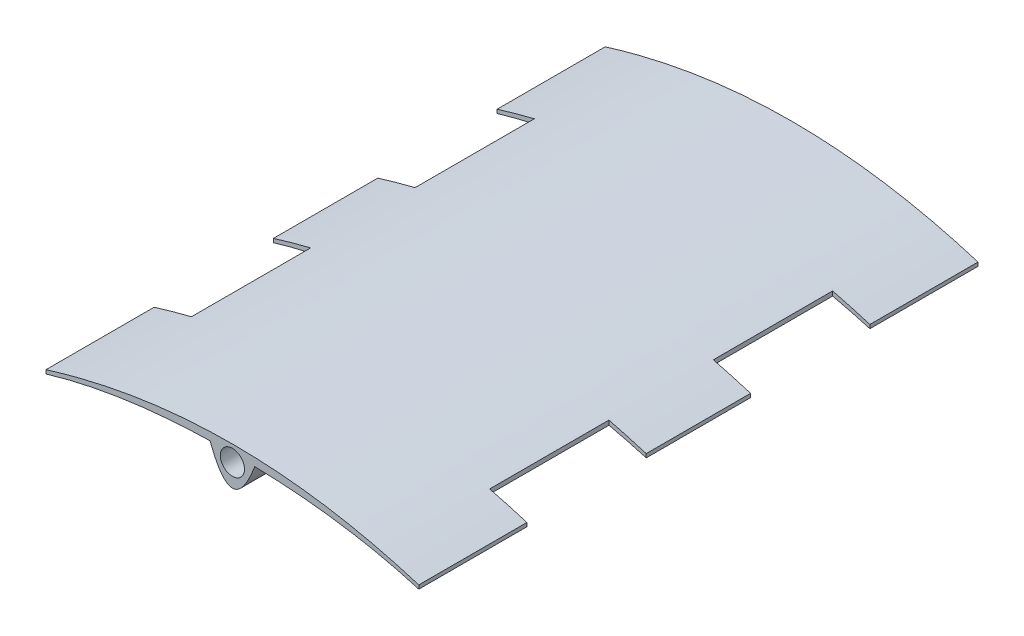
ISO-10303-21;
HEADER;
FILE_DESCRIPTION(('STEP AP214'),'2;1');
FILE_NAME('part.step','',(''),(''),'','','');
FILE_SCHEMA(('AUTOMOTIVE_DESIGN { 1 0 10303 214 1 1 1 1 }'));
ENDSEC;
DATA;
#1=APPLICATION_CONTEXT('core data for automotive mechanical design processes');
#2=APPLICATION_PROTOCOL_DEFINITION('international standard','automotive_design',2000,#1);
#3=PRODUCT_CONTEXT('',#1,'mechanical');
#4=PRODUCT('Part','Part','',(#3));
#5=PRODUCT_RELATED_PRODUCT_CATEGORY('part','',(#4));
#6=PRODUCT_DEFINITION_FORMATION('','',#4);
#7=PRODUCT_DEFINITION_CONTEXT('part definition',#1,'design');
#8=PRODUCT_DEFINITION('design','',#6,#7);
#9=PRODUCT_DEFINITION_SHAPE('','',#8);
#10=(LENGTH_UNIT() NAMED_UNIT(*) SI_UNIT(.MILLI.,.METRE.));
#11=(NAMED_UNIT(*) PLANE_ANGLE_UNIT() SI_UNIT($,.RADIAN.));
#12=(NAMED_UNIT(*) SI_UNIT($,.STERADIAN.) SOLID_ANGLE_UNIT());
#13=UNCERTAINTY_MEASURE_WITH_UNIT(LENGTH_MEASURE(1.E-05),#10,'distance_accuracy_value','');
#14=(GEOMETRIC_REPRESENTATION_CONTEXT(3) GLOBAL_UNCERTAINTY_ASSIGNED_CONTEXT((#13)) GLOBAL_UNIT_ASSIGNED_CONTEXT((#10,
#11,#12)) REPRESENTATION_CONTEXT('',''));
#15=CARTESIAN_POINT('',(0.,0.,0.));
#16=DIRECTION('',(0.,0.,1.));
#17=DIRECTION('',(1.,0.,0.));
#18=AXIS2_PLACEMENT_3D('',#15,#16,#17);
#19=CARTESIAN_POINT('',(-50.,-3.48064682392032,150.));
#20=DIRECTION('',(1.,0.,0.));
#21=DIRECTION('',(0.,0.,-1.));
#22=AXIS2_PLACEMENT_3D('',#19,#20,#21);
#23=PLANE('',#22);
#24=DIRECTION('',(0.,0.,-1.));
#25=VECTOR('',#24,1.);
#26=CARTESIAN_POINT('',(-50.,-4.48064682392032,150.));
#27=LINE('',#26,#25);
#28=CARTESIAN_POINT('',(-50.,-4.48064682392032,29.));
#29=VERTEX_POINT('',#28);
#30=CARTESIAN_POINT('',(-50.,-4.48064682392032,0.));
#31=VERTEX_POINT('',#30);
#32=EDGE_CURVE('E526',#29,#31,#27,.T.);
#33=ORIENTED_EDGE('',*,*,#32,.F.);
#34=DIRECTION('',(0.,1.,0.));
#35=VECTOR('',#34,1.);
#36=CARTESIAN_POINT('',(-50.,-6.,29.));
#37=LINE('',#36,#35);
#38=CARTESIAN_POINT('',(-50.,-3.48064682392032,29.));
#39=VERTEX_POINT('',#38);
#40=EDGE_CURVE('E441',#29,#39,#37,.T.);
#41=ORIENTED_EDGE('',*,*,#40,.T.);
#42=DIRECTION('',(0.,0.,-1.));
#43=VECTOR('',#42,1.);
#44=CARTESIAN_POINT('',(-50.,-3.48064682392032,150.));
#45=LINE('',#44,#43);
#46=CARTESIAN_POINT('',(-50.,-3.48064682392032,0.));
#47=VERTEX_POINT('',#46);
#48=EDGE_CURVE('E390',#39,#47,#45,.T.);
#49=ORIENTED_EDGE('',*,*,#48,.T.);
#50=DIRECTION('',(0.,-1.,0.));
#51=VECTOR('',#50,1.);
#52=CARTESIAN_POINT('',(-50.,-3.48064682392032,0.));
#53=LINE('',#52,#51);
#54=EDGE_CURVE('E491',#47,#31,#53,.T.);
#55=ORIENTED_EDGE('',*,*,#54,.T.);
#56=EDGE_LOOP('',(#33,#41,#49,#55));
#57=FACE_BOUND('',#56,.T.);
#58=ADVANCED_FACE('F33',(#57),#23,.F.);
#59=CARTESIAN_POINT('',(-50.,-3.48064682392032,89.));
#60=VERTEX_POINT('',#59);
#61=CARTESIAN_POINT('',(-50.,-3.48064682392032,61.));
#62=VERTEX_POINT('',#61);
#63=EDGE_CURVE('E385',#60,#62,#45,.T.);
#64=ORIENTED_EDGE('',*,*,#63,.T.);
#65=DIRECTION('',(0.,1.,0.));
#66=VECTOR('',#65,1.);
#67=CARTESIAN_POINT('',(-50.,-6.,61.));
#68=LINE('',#67,#66);
#69=CARTESIAN_POINT('',(-50.,-4.48064682392032,61.));
#70=VERTEX_POINT('',#69);
#71=EDGE_CURVE('E387',#70,#62,#68,.T.);
#72=ORIENTED_EDGE('',*,*,#71,.F.);
#73=CARTESIAN_POINT('',(-50.,-4.48064682392032,89.));
#74=VERTEX_POINT('',#73);
#75=EDGE_CURVE('E741',#74,#70,#27,.T.);
#76=ORIENTED_EDGE('',*,*,#75,.F.);
#77=DIRECTION('',(0.,1.,0.));
#78=VECTOR('',#77,1.);
#79=CARTESIAN_POINT('',(-50.,-6.,89.));
#80=LINE('',#79,#78);
#81=EDGE_CURVE('E212',#74,#60,#80,.T.);
#82=ORIENTED_EDGE('',*,*,#81,.T.);
#83=EDGE_LOOP('',(#64,#72,#76,#82));
#84=FACE_BOUND('',#83,.T.);
#85=ADVANCED_FACE('F363',(#84),#23,.F.);
#86=CARTESIAN_POINT('',(50.,-3.48064682392032,150.));
#87=DIRECTION('',(-1.,0.,0.));
#88=DIRECTION('',(0.,0.,1.));
#89=AXIS2_PLACEMENT_3D('',#86,#87,#88);
#90=PLANE('',#89);
#91=DIRECTION('',(0.,0.,-1.));
#92=VECTOR('',#91,1.);
#93=CARTESIAN_POINT('',(50.,-4.48064682392032,150.));
#94=LINE('',#93,#92);
#95=CARTESIAN_POINT('',(50.,-4.48064682392032,150.));
#96=VERTEX_POINT('',#95);
#97=CARTESIAN_POINT('',(50.,-4.48064682392032,121.));
#98=VERTEX_POINT('',#97);
#99=EDGE_CURVE('E476',#96,#98,#94,.T.);
#100=ORIENTED_EDGE('',*,*,#99,.T.);
#101=DIRECTION('',(0.,1.,0.));
#102=VECTOR('',#101,1.);
#103=CARTESIAN_POINT('',(50.,-3.48064682392032,121.));
#104=LINE('',#103,#102);
#105=CARTESIAN_POINT('',(50.,-3.48064682392032,121.));
#106=VERTEX_POINT('',#105);
#107=EDGE_CURVE('E197',#98,#106,#104,.T.);
#108=ORIENTED_EDGE('',*,*,#107,.T.);
#109=DIRECTION('',(0.,0.,-1.));
#110=VECTOR('',#109,1.);
#111=CARTESIAN_POINT('',(50.,-3.48064682392032,150.));
#112=LINE('',#111,#110);
#113=CARTESIAN_POINT('',(50.,-3.48064682392032,150.));
#114=VERTEX_POINT('',#113);
#115=EDGE_CURVE('E470',#114,#106,#112,.T.);
#116=ORIENTED_EDGE('',*,*,#115,.F.);
#117=DIRECTION('',(0.,1.,0.));
#118=VECTOR('',#117,1.);
#119=CARTESIAN_POINT('',(50.,-3.48064682392032,150.));
#120=LINE('',#119,#118);
#121=EDGE_CURVE('E468',#96,#114,#120,.T.);
#122=ORIENTED_EDGE('',*,*,#121,.F.);
#123=EDGE_LOOP('',(#100,#108,#116,#122));
#124=FACE_BOUND('',#123,.T.);
#125=ADVANCED_FACE('F373',(#124),#90,.F.);
#126=CARTESIAN_POINT('',(50.,-3.48064682392032,89.));
#127=VERTEX_POINT('',#126);
#128=CARTESIAN_POINT('',(50.,-3.48064682392032,61.));
#129=VERTEX_POINT('',#128);
#130=EDGE_CURVE('E471',#127,#129,#112,.T.);
#131=ORIENTED_EDGE('',*,*,#130,.F.);
#132=DIRECTION('',(0.,-1.,0.));
#133=VECTOR('',#132,1.);
#134=CARTESIAN_POINT('',(50.,-3.48064682392032,89.));
#135=LINE('',#134,#133);
#136=CARTESIAN_POINT('',(50.,-4.48064682392032,89.));
#137=VERTEX_POINT('',#136);
#138=EDGE_CURVE('E401',#127,#137,#135,.T.);
#139=ORIENTED_EDGE('',*,*,#138,.T.);
#140=CARTESIAN_POINT('',(50.,-4.48064682392032,61.));
#141=VERTEX_POINT('',#140);
#142=EDGE_CURVE('E474',#137,#141,#94,.T.);
#143=ORIENTED_EDGE('',*,*,#142,.T.);
#144=DIRECTION('',(0.,1.,0.));
#145=VECTOR('',#144,1.);
#146=CARTESIAN_POINT('',(50.,-3.48064682392032,61.));
#147=LINE('',#146,#145);
#148=EDGE_CURVE('E398',#141,#129,#147,.T.);
#149=ORIENTED_EDGE('',*,*,#148,.T.);
#150=EDGE_LOOP('',(#131,#139,#143,#149));
#151=FACE_BOUND('',#150,.T.);
#152=ADVANCED_FACE('F378',(#151),#90,.F.);
#153=CARTESIAN_POINT('',(0.,4.25967658803984,150.));
#154=DIRECTION('',(0.,0.,1.));
#155=DIRECTION('',(1.,0.,0.));
#156=AXIS2_PLACEMENT_3D('',#153,#154,#155);
#157=PLANE('',#156);
#158=CARTESIAN_POINT('',(50.,-3.48064682392032,150.));
#159=CARTESIAN_POINT('',(0.,12.,150.));
#160=CARTESIAN_POINT('',(-50.,-3.48064682392032,150.));
#161=B_SPLINE_CURVE_WITH_KNOTS('',2,(#158,#159,#160),.UNSPECIFIED.,.F.,.F.,(3,3),(0.,1.),.UNSPECIFIED.);
#162=CARTESIAN_POINT('',(-50.,-3.48064682392032,150.));
#163=VERTEX_POINT('',#162);
#164=EDGE_CURVE('E328',#114,#163,#161,.T.);
#165=ORIENTED_EDGE('',*,*,#164,.T.);
#166=DIRECTION('',(0.,-1.,0.));
#167=VECTOR('',#166,1.);
#168=CARTESIAN_POINT('',(-50.,-3.48064682392032,150.));
#169=LINE('',#168,#167);
#170=CARTESIAN_POINT('',(-50.,-4.48064682392032,150.));
#171=VERTEX_POINT('',#170);
#172=EDGE_CURVE('E334',#163,#171,#169,.T.);
#173=ORIENTED_EDGE('',*,*,#172,.T.);
#174=CARTESIAN_POINT('',(-50.,-4.48064682392032,150.));
#175=CARTESIAN_POINT('',(-30.,1.47316015973418,150.));
#176=CARTESIAN_POINT('',(-6.,2.,150.));
#177=B_SPLINE_CURVE_WITH_KNOTS('',2,(#174,#175,#176),.UNSPECIFIED.,.F.,.F.,(3,3),(0.,1.),.UNSPECIFIED.);
#178=CARTESIAN_POINT('',(-6.,2.,150.));
#179=VERTEX_POINT('',#178);
#180=EDGE_CURVE('E340',#171,#179,#177,.T.);
#181=ORIENTED_EDGE('',*,*,#180,.T.);
#182=CARTESIAN_POINT('',(-6.,2.,150.));
#183=CARTESIAN_POINT('',(0.,-14.,150.));
#184=CARTESIAN_POINT('',(6.,2.,150.));
#185=B_SPLINE_CURVE_WITH_KNOTS('',2,(#182,#183,#184),.UNSPECIFIED.,.F.,.F.,(3,3),(0.,1.),.UNSPECIFIED.);
#186=CARTESIAN_POINT('',(6.,2.,150.));
#187=VERTEX_POINT('',#186);
#188=EDGE_CURVE('E345',#179,#187,#185,.T.);
#189=ORIENTED_EDGE('',*,*,#188,.T.);
#190=CARTESIAN_POINT('',(6.,2.,150.));
#191=CARTESIAN_POINT('',(30.,1.47316015973418,150.));
#192=CARTESIAN_POINT('',(50.,-4.48064682392032,150.));
#193=B_SPLINE_CURVE_WITH_KNOTS('',2,(#190,#191,#192),.UNSPECIFIED.,.F.,.F.,(3,3),(0.,1.),.UNSPECIFIED.);
#194=EDGE_CURVE('E482',#187,#96,#193,.T.);
#195=ORIENTED_EDGE('',*,*,#194,.T.);
#196=ORIENTED_EDGE('',*,*,#121,.T.);
#197=EDGE_LOOP('',(#165,#173,#181,#189,#195,#196));
#198=FACE_BOUND('',#197,.T.);
#199=CARTESIAN_POINT('',(0.,0.,150.));
#200=DIRECTION('',(0.,0.,1.));
#201=DIRECTION('',(1.,0.,0.));
#202=AXIS2_PLACEMENT_3D('',#199,#200,#201);
#203=CIRCLE('',#202,3.25);
#204=CARTESIAN_POINT('',(3.25,0.,150.));
#205=VERTEX_POINT('',#204);
#206=EDGE_CURVE('E320',#205,#205,#203,.T.);
#207=ORIENTED_EDGE('',*,*,#206,.F.);
#208=EDGE_LOOP('',(#207));
#209=FACE_BOUND('',#208,.T.);
#210=ADVANCED_FACE('F465',(#198,#209),#157,.T.);
#211=CARTESIAN_POINT('',(0.,4.25967658803984,0.));
#212=DIRECTION('',(0.,0.,1.));
#213=DIRECTION('',(1.,0.,0.));
#214=AXIS2_PLACEMENT_3D('',#211,#212,#213);
#215=PLANE('',#214);
#216=CARTESIAN_POINT('',(50.,-3.48064682392032,0.));
#217=CARTESIAN_POINT('',(0.,12.,0.));
#218=CARTESIAN_POINT('',(-50.,-3.48064682392032,0.));
#219=B_SPLINE_CURVE_WITH_KNOTS('',2,(#216,#217,#218),.UNSPECIFIED.,.F.,.F.,(3,3),(0.,1.),.UNSPECIFIED.);
#220=CARTESIAN_POINT('',(50.,-3.48064682392032,0.));
#221=VERTEX_POINT('',#220);
#222=EDGE_CURVE('E326',#221,#47,#219,.T.);
#223=ORIENTED_EDGE('',*,*,#222,.F.);
#224=DIRECTION('',(0.,1.,0.));
#225=VECTOR('',#224,1.);
#226=CARTESIAN_POINT('',(50.,-3.48064682392032,0.));
#227=LINE('',#226,#225);
#228=CARTESIAN_POINT('',(50.,-4.48064682392032,0.));
#229=VERTEX_POINT('',#228);
#230=EDGE_CURVE('E335',#229,#221,#227,.T.);
#231=ORIENTED_EDGE('',*,*,#230,.F.);
#232=CARTESIAN_POINT('',(6.,2.,0.));
#233=CARTESIAN_POINT('',(30.,1.47316015973418,0.));
#234=CARTESIAN_POINT('',(50.,-4.48064682392032,0.));
#235=B_SPLINE_CURVE_WITH_KNOTS('',2,(#232,#233,#234),.UNSPECIFIED.,.F.,.F.,(3,3),(0.,1.),.UNSPECIFIED.);
#236=CARTESIAN_POINT('',(6.,2.,0.));
#237=VERTEX_POINT('',#236);
#238=EDGE_CURVE('E508',#237,#229,#235,.T.);
#239=ORIENTED_EDGE('',*,*,#238,.F.);
#240=CARTESIAN_POINT('',(-6.,2.,0.));
#241=CARTESIAN_POINT('',(0.,-14.,0.));
#242=CARTESIAN_POINT('',(6.,2.,0.));
#243=B_SPLINE_CURVE_WITH_KNOTS('',2,(#240,#241,#242),.UNSPECIFIED.,.F.,.F.,(3,3),(0.,1.),.UNSPECIFIED.);
#244=CARTESIAN_POINT('',(-6.,2.,0.));
#245=VERTEX_POINT('',#244);
#246=EDGE_CURVE('E501',#245,#237,#243,.T.);
#247=ORIENTED_EDGE('',*,*,#246,.F.);
#248=CARTESIAN_POINT('',(-50.,-4.48064682392032,0.));
#249=CARTESIAN_POINT('',(-30.,1.47316015973418,0.));
#250=CARTESIAN_POINT('',(-6.,2.,0.));
#251=B_SPLINE_CURVE_WITH_KNOTS('',2,(#248,#249,#250),.UNSPECIFIED.,.F.,.F.,(3,3),(0.,1.),.UNSPECIFIED.);
#252=EDGE_CURVE('E497',#31,#245,#251,.T.);
#253=ORIENTED_EDGE('',*,*,#252,.F.);
#254=ORIENTED_EDGE('',*,*,#54,.F.);
#255=EDGE_LOOP('',(#223,#231,#239,#247,#253,#254));
#256=FACE_BOUND('',#255,.T.);
#257=CARTESIAN_POINT('',(0.,0.,0.));
#258=DIRECTION('',(0.,0.,1.));
#259=DIRECTION('',(1.,0.,0.));
#260=AXIS2_PLACEMENT_3D('',#257,#258,#259);
#261=CIRCLE('',#260,3.25);
#262=CARTESIAN_POINT('',(3.25,0.,0.));
#263=VERTEX_POINT('',#262);
#264=EDGE_CURVE('E319',#263,#263,#261,.T.);
#265=ORIENTED_EDGE('',*,*,#264,.T.);
#266=EDGE_LOOP('',(#265));
#267=FACE_BOUND('',#266,.T.);
#268=ADVANCED_FACE('F367',(#256,#267),#215,.F.);
#269=DIRECTION('',(0.,0.,-1.));
#270=VECTOR('',#269,1.);
#271=SURFACE_OF_LINEAR_EXTRUSION('',#161,#270);
#272=ORIENTED_EDGE('',*,*,#115,.T.);
#273=CARTESIAN_POINT('',(50.,-3.48064682392032,121.));
#274=CARTESIAN_POINT('',(0.,12.,121.));
#275=CARTESIAN_POINT('',(-50.,-3.48064682392032,121.));
#276=B_SPLINE_CURVE_WITH_KNOTS('',2,(#273,#274,#275),.UNSPECIFIED.,.F.,.F.,(3,3),(0.,1.),.UNSPECIFIED.);
#277=CARTESIAN_POINT('',(40.,-0.694130395614669,121.));
#278=VERTEX_POINT('',#277);
#279=EDGE_CURVE('E268',#106,#278,#276,.T.);
#280=ORIENTED_EDGE('',*,*,#279,.T.);
#281=DIRECTION('',(0.,0.,-1.));
#282=VECTOR('',#281,1.);
#283=CARTESIAN_POINT('',(40.,-0.694130395614669,150.));
#284=LINE('',#283,#282);
#285=CARTESIAN_POINT('',(40.,-0.694130395614667,89.));
#286=VERTEX_POINT('',#285);
#287=EDGE_CURVE('E281',#278,#286,#284,.T.);
#288=ORIENTED_EDGE('',*,*,#287,.T.);
#289=CARTESIAN_POINT('',(50.,-3.48064682392032,89.));
#290=CARTESIAN_POINT('',(0.,12.,89.));
#291=CARTESIAN_POINT('',(-50.,-3.48064682392032,89.));
#292=B_SPLINE_CURVE_WITH_KNOTS('',2,(#289,#290,#291),.UNSPECIFIED.,.F.,.F.,(3,3),(0.,1.),.UNSPECIFIED.);
#293=EDGE_CURVE('E252',#286,#127,#292,.F.);
#294=ORIENTED_EDGE('',*,*,#293,.T.);
#295=ORIENTED_EDGE('',*,*,#130,.T.);
#296=CARTESIAN_POINT('',(50.,-3.48064682392032,61.));
#297=CARTESIAN_POINT('',(0.,12.,61.));
#298=CARTESIAN_POINT('',(-50.,-3.48064682392032,61.));
#299=B_SPLINE_CURVE_WITH_KNOTS('',2,(#296,#297,#298),.UNSPECIFIED.,.F.,.F.,(3,3),(0.,1.),.UNSPECIFIED.);
#300=CARTESIAN_POINT('',(40.,-0.694130395614685,61.));
#301=VERTEX_POINT('',#300);
#302=EDGE_CURVE('E236',#129,#301,#299,.T.);
#303=ORIENTED_EDGE('',*,*,#302,.T.);
#304=DIRECTION('',(0.,0.,-1.));
#305=VECTOR('',#304,1.);
#306=CARTESIAN_POINT('',(40.0000000000001,-0.694130395614685,150.));
#307=LINE('',#306,#305);
#308=CARTESIAN_POINT('',(40.,-0.694130395614657,29.));
#309=VERTEX_POINT('',#308);
#310=EDGE_CURVE('E276',#301,#309,#307,.T.);
#311=ORIENTED_EDGE('',*,*,#310,.T.);
#312=CARTESIAN_POINT('',(50.,-3.48064682392032,29.));
#313=CARTESIAN_POINT('',(0.,12.,29.));
#314=CARTESIAN_POINT('',(-50.,-3.48064682392032,29.));
#315=B_SPLINE_CURVE_WITH_KNOTS('',2,(#312,#313,#314),.UNSPECIFIED.,.F.,.F.,(3,3),(0.,1.),.UNSPECIFIED.);
#316=CARTESIAN_POINT('',(50.,-3.48064682392032,29.));
#317=VERTEX_POINT('',#316);
#318=EDGE_CURVE('E204',#309,#317,#315,.F.);
#319=ORIENTED_EDGE('',*,*,#318,.T.);
#320=EDGE_CURVE('E473',#317,#221,#112,.T.);
#321=ORIENTED_EDGE('',*,*,#320,.T.);
#322=ORIENTED_EDGE('',*,*,#222,.T.);
#323=ORIENTED_EDGE('',*,*,#48,.F.);
#324=CARTESIAN_POINT('',(50.,-3.48064682392032,29.));
#325=CARTESIAN_POINT('',(0.,12.,29.));
#326=CARTESIAN_POINT('',(-50.,-3.48064682392032,29.));
#327=B_SPLINE_CURVE_WITH_KNOTS('',2,(#324,#325,#326),.UNSPECIFIED.,.F.,.F.,(3,3),(0.,1.),.UNSPECIFIED.);
#328=CARTESIAN_POINT('',(-40.,-0.694130395614653,29.));
#329=VERTEX_POINT('',#328);
#330=EDGE_CURVE('E314',#39,#329,#327,.F.);
#331=ORIENTED_EDGE('',*,*,#330,.T.);
#332=DIRECTION('',(0.,0.,-1.));
#333=VECTOR('',#332,1.);
#334=CARTESIAN_POINT('',(-40.,-0.694130395614653,150.));
#335=LINE('',#334,#333);
#336=CARTESIAN_POINT('',(-40.,-0.694130395614659,61.));
#337=VERTEX_POINT('',#336);
#338=EDGE_CURVE('E308',#329,#337,#335,.F.);
#339=ORIENTED_EDGE('',*,*,#338,.T.);
#340=CARTESIAN_POINT('',(50.,-3.48064682392032,61.));
#341=CARTESIAN_POINT('',(0.,12.,61.));
#342=CARTESIAN_POINT('',(-50.,-3.48064682392032,61.));
#343=B_SPLINE_CURVE_WITH_KNOTS('',2,(#340,#341,#342),.UNSPECIFIED.,.F.,.F.,(3,3),(0.,1.),.UNSPECIFIED.);
#344=EDGE_CURVE('E300',#337,#62,#343,.T.);
#345=ORIENTED_EDGE('',*,*,#344,.T.);
#346=ORIENTED_EDGE('',*,*,#63,.F.);
#347=CARTESIAN_POINT('',(50.,-3.48064682392032,89.));
#348=CARTESIAN_POINT('',(0.,12.,89.));
#349=CARTESIAN_POINT('',(-50.,-3.48064682392032,89.));
#350=B_SPLINE_CURVE_WITH_KNOTS('',2,(#347,#348,#349),.UNSPECIFIED.,.F.,.F.,(3,3),(0.,1.),.UNSPECIFIED.);
#351=CARTESIAN_POINT('',(-40.,-0.694130395614659,89.));
#352=VERTEX_POINT('',#351);
#353=EDGE_CURVE('E295',#60,#352,#350,.F.);
#354=ORIENTED_EDGE('',*,*,#353,.T.);
#355=DIRECTION('',(0.,0.,-1.));
#356=VECTOR('',#355,1.);
#357=CARTESIAN_POINT('',(-40.,-0.694130395614659,150.));
#358=LINE('',#357,#356);
#359=CARTESIAN_POINT('',(-40.,-0.694130395614659,121.));
#360=VERTEX_POINT('',#359);
#361=EDGE_CURVE('E289',#352,#360,#358,.F.);
#362=ORIENTED_EDGE('',*,*,#361,.T.);
#363=CARTESIAN_POINT('',(50.,-3.48064682392032,121.));
#364=CARTESIAN_POINT('',(0.,12.,121.));
#365=CARTESIAN_POINT('',(-50.,-3.48064682392032,121.));
#366=B_SPLINE_CURVE_WITH_KNOTS('',2,(#363,#364,#365),.UNSPECIFIED.,.F.,.F.,(3,3),(0.,1.),.UNSPECIFIED.);
#367=CARTESIAN_POINT('',(-50.,-3.48064682392032,121.));
#368=VERTEX_POINT('',#367);
#369=EDGE_CURVE('E284',#360,#368,#366,.T.);
#370=ORIENTED_EDGE('',*,*,#369,.T.);
#371=EDGE_CURVE('E389',#163,#368,#45,.T.);
#372=ORIENTED_EDGE('',*,*,#371,.F.);
#373=ORIENTED_EDGE('',*,*,#164,.F.);
#374=EDGE_LOOP('',(#272,#280,#288,#294,#295,#303,#311,#319,#321,#322,#323,#331,#339,#345,#346,
#354,#362,#370,#372,#373));
#375=FACE_BOUND('',#374,.T.);
#376=ADVANCED_FACE('F35',(#375),#271,.F.);
#377=ORIENTED_EDGE('',*,*,#371,.T.);
#378=DIRECTION('',(0.,1.,0.));
#379=VECTOR('',#378,1.);
#380=CARTESIAN_POINT('',(-50.,-6.,121.));
#381=LINE('',#380,#379);
#382=CARTESIAN_POINT('',(-50.,-4.48064682392032,121.));
#383=VERTEX_POINT('',#382);
#384=EDGE_CURVE('E222',#383,#368,#381,.T.);
#385=ORIENTED_EDGE('',*,*,#384,.F.);
#386=EDGE_CURVE('E393',#171,#383,#27,.T.);
#387=ORIENTED_EDGE('',*,*,#386,.F.);
#388=ORIENTED_EDGE('',*,*,#172,.F.);
#389=EDGE_LOOP('',(#377,#385,#387,#388));
#390=FACE_BOUND('',#389,.T.);
#391=ADVANCED_FACE('F358',(#390),#23,.F.);
#392=DIRECTION('',(0.,0.,-1.));
#393=VECTOR('',#392,1.);
#394=SURFACE_OF_LINEAR_EXTRUSION('',#177,#393);
#395=DIRECTION('',(0.,0.,-1.));
#396=VECTOR('',#395,1.);
#397=CARTESIAN_POINT('',(-40.,-1.89787930509325,150.));
#398=LINE('',#397,#396);
#399=CARTESIAN_POINT('',(-40.0000000000509,-1.89787930510449,61.));
#400=VERTEX_POINT('',#399);
#401=CARTESIAN_POINT('',(-40.,-1.89787930509325,29.));
#402=VERTEX_POINT('',#401);
#403=EDGE_CURVE('E44',#400,#402,#398,.T.);
#404=ORIENTED_EDGE('',*,*,#403,.T.);
#405=CARTESIAN_POINT('',(-50.,-4.48064682392032,29.));
#406=CARTESIAN_POINT('',(-30.,1.47316015973418,29.));
#407=CARTESIAN_POINT('',(-6.,2.,29.));
#408=B_SPLINE_CURVE_WITH_KNOTS('',2,(#405,#406,#407),.UNSPECIFIED.,.F.,.F.,(3,3),(0.,1.),.UNSPECIFIED.);
#409=EDGE_CURVE('E11',#402,#29,#408,.F.);
#410=ORIENTED_EDGE('',*,*,#409,.T.);
#411=ORIENTED_EDGE('',*,*,#32,.T.);
#412=ORIENTED_EDGE('',*,*,#252,.T.);
#413=DIRECTION('',(0.,0.,-1.));
#414=VECTOR('',#413,1.);
#415=CARTESIAN_POINT('',(-6.,2.,150.));
#416=LINE('',#415,#414);
#417=EDGE_CURVE('E590',#179,#245,#416,.T.);
#418=ORIENTED_EDGE('',*,*,#417,.F.);
#419=ORIENTED_EDGE('',*,*,#180,.F.);
#420=ORIENTED_EDGE('',*,*,#386,.T.);
#421=CARTESIAN_POINT('',(-50.,-4.48064682392032,121.));
#422=CARTESIAN_POINT('',(-30.,1.47316015973418,121.));
#423=CARTESIAN_POINT('',(-6.,2.,121.));
#424=B_SPLINE_CURVE_WITH_KNOTS('',2,(#421,#422,#423),.UNSPECIFIED.,.F.,.F.,(3,3),(0.,1.),.UNSPECIFIED.);
#425=CARTESIAN_POINT('',(-40.0000000000509,-1.89787930510449,121.));
#426=VERTEX_POINT('',#425);
#427=EDGE_CURVE('E407',#383,#426,#424,.T.);
#428=ORIENTED_EDGE('',*,*,#427,.T.);
#429=DIRECTION('',(0.,0.,-1.));
#430=VECTOR('',#429,1.);
#431=CARTESIAN_POINT('',(-40.,-1.89787930509325,150.));
#432=LINE('',#431,#430);
#433=CARTESIAN_POINT('',(-40.,-1.89787930509325,89.));
#434=VERTEX_POINT('',#433);
#435=EDGE_CURVE('E412',#426,#434,#432,.T.);
#436=ORIENTED_EDGE('',*,*,#435,.T.);
#437=CARTESIAN_POINT('',(-50.,-4.48064682392032,89.));
#438=CARTESIAN_POINT('',(-30.,1.47316015973418,89.));
#439=CARTESIAN_POINT('',(-6.,2.,89.));
#440=B_SPLINE_CURVE_WITH_KNOTS('',2,(#437,#438,#439),.UNSPECIFIED.,.F.,.F.,(3,3),(0.,1.),.UNSPECIFIED.);
#441=EDGE_CURVE('E418',#434,#74,#440,.F.);
#442=ORIENTED_EDGE('',*,*,#441,.T.);
#443=ORIENTED_EDGE('',*,*,#75,.T.);
#444=CARTESIAN_POINT('',(-50.,-4.48064682392032,61.));
#445=CARTESIAN_POINT('',(-30.,1.47316015973418,61.));
#446=CARTESIAN_POINT('',(-6.,2.,61.));
#447=B_SPLINE_CURVE_WITH_KNOTS('',2,(#444,#445,#446),.UNSPECIFIED.,.F.,.F.,(3,3),(0.,1.),.UNSPECIFIED.);
#448=EDGE_CURVE('E423',#70,#400,#447,.T.);
#449=ORIENTED_EDGE('',*,*,#448,.T.);
#450=EDGE_LOOP('',(#404,#410,#411,#412,#418,#419,#420,#428,#436,#442,#443,#449));
#451=FACE_BOUND('',#450,.T.);
#452=ADVANCED_FACE('F354',(#451),#394,.F.);
#453=DIRECTION('',(0.,0.,-1.));
#454=VECTOR('',#453,1.);
#455=SURFACE_OF_LINEAR_EXTRUSION('',#185,#454);
#456=ORIENTED_EDGE('',*,*,#246,.T.);
#457=DIRECTION('',(0.,0.,-1.));
#458=VECTOR('',#457,1.);
#459=CARTESIAN_POINT('',(6.,2.,150.));
#460=LINE('',#459,#458);
#461=EDGE_CURVE('E587',#187,#237,#460,.T.);
#462=ORIENTED_EDGE('',*,*,#461,.F.);
#463=ORIENTED_EDGE('',*,*,#188,.F.);
#464=ORIENTED_EDGE('',*,*,#417,.T.);
#465=EDGE_LOOP('',(#456,#462,#463,#464));
#466=FACE_BOUND('',#465,.T.);
#467=ADVANCED_FACE('F357',(#466),#455,.F.);
#468=DIRECTION('',(0.,0.,-1.));
#469=VECTOR('',#468,1.);
#470=SURFACE_OF_LINEAR_EXTRUSION('',#193,#469);
#471=DIRECTION('',(0.,0.,-1.));
#472=VECTOR('',#471,1.);
#473=CARTESIAN_POINT('',(40.,-1.89787930509327,150.));
#474=LINE('',#473,#472);
#475=CARTESIAN_POINT('',(40.,-1.8978793051045,89.));
#476=VERTEX_POINT('',#475);
#477=CARTESIAN_POINT('',(40.,-1.89787930509326,121.));
#478=VERTEX_POINT('',#477);
#479=EDGE_CURVE('E196',#476,#478,#474,.F.);
#480=ORIENTED_EDGE('',*,*,#479,.T.);
#481=CARTESIAN_POINT('',(6.,2.,121.));
#482=CARTESIAN_POINT('',(30.,1.47316015973418,121.));
#483=CARTESIAN_POINT('',(50.,-4.48064682392032,121.));
#484=B_SPLINE_CURVE_WITH_KNOTS('',2,(#481,#482,#483),.UNSPECIFIED.,.F.,.F.,(3,3),(0.,1.),.UNSPECIFIED.);
#485=EDGE_CURVE('E260',#478,#98,#484,.T.);
#486=ORIENTED_EDGE('',*,*,#485,.T.);
#487=ORIENTED_EDGE('',*,*,#99,.F.);
#488=ORIENTED_EDGE('',*,*,#194,.F.);
#489=ORIENTED_EDGE('',*,*,#461,.T.);
#490=ORIENTED_EDGE('',*,*,#238,.T.);
#491=CARTESIAN_POINT('',(50.,-4.48064682392032,29.));
#492=VERTEX_POINT('',#491);
#493=EDGE_CURVE('E211',#492,#229,#94,.T.);
#494=ORIENTED_EDGE('',*,*,#493,.F.);
#495=CARTESIAN_POINT('',(6.,2.,29.));
#496=CARTESIAN_POINT('',(30.,1.47316015973418,29.));
#497=CARTESIAN_POINT('',(50.,-4.48064682392032,29.));
#498=B_SPLINE_CURVE_WITH_KNOTS('',2,(#495,#496,#497),.UNSPECIFIED.,.F.,.F.,(3,3),(0.,1.),.UNSPECIFIED.);
#499=CARTESIAN_POINT('',(40.,-1.89787930510449,29.));
#500=VERTEX_POINT('',#499);
#501=EDGE_CURVE('E201',#492,#500,#498,.F.);
#502=ORIENTED_EDGE('',*,*,#501,.T.);
#503=DIRECTION('',(0.,0.,-1.));
#504=VECTOR('',#503,1.);
#505=CARTESIAN_POINT('',(40.0000000000001,-1.89787930509327,150.));
#506=LINE('',#505,#504);
#507=CARTESIAN_POINT('',(40.,-1.89787930509327,61.));
#508=VERTEX_POINT('',#507);
#509=EDGE_CURVE('E186',#500,#508,#506,.F.);
#510=ORIENTED_EDGE('',*,*,#509,.T.);
#511=CARTESIAN_POINT('',(6.,2.,61.));
#512=CARTESIAN_POINT('',(30.,1.47316015973418,61.));
#513=CARTESIAN_POINT('',(50.,-4.48064682392032,61.));
#514=B_SPLINE_CURVE_WITH_KNOTS('',2,(#511,#512,#513),.UNSPECIFIED.,.F.,.F.,(3,3),(0.,1.),.UNSPECIFIED.);
#515=EDGE_CURVE('E214',#508,#141,#514,.T.);
#516=ORIENTED_EDGE('',*,*,#515,.T.);
#517=ORIENTED_EDGE('',*,*,#142,.F.);
#518=CARTESIAN_POINT('',(6.,2.,89.));
#519=CARTESIAN_POINT('',(30.,1.47316015973418,89.));
#520=CARTESIAN_POINT('',(50.,-4.48064682392032,89.));
#521=B_SPLINE_CURVE_WITH_KNOTS('',2,(#518,#519,#520),.UNSPECIFIED.,.F.,.F.,(3,3),(0.,1.),.UNSPECIFIED.);
#522=EDGE_CURVE('E244',#137,#476,#521,.F.);
#523=ORIENTED_EDGE('',*,*,#522,.T.);
#524=EDGE_LOOP('',(#480,#486,#487,#488,#489,#490,#494,#502,#510,#516,#517,#523));
#525=FACE_BOUND('',#524,.T.);
#526=ADVANCED_FACE('F209',(#525),#470,.F.);
#527=ORIENTED_EDGE('',*,*,#320,.F.);
#528=DIRECTION('',(0.,-1.,0.));
#529=VECTOR('',#528,1.);
#530=CARTESIAN_POINT('',(50.,-3.48064682392032,29.));
#531=LINE('',#530,#529);
#532=EDGE_CURVE('E392',#317,#492,#531,.T.);
#533=ORIENTED_EDGE('',*,*,#532,.T.);
#534=ORIENTED_EDGE('',*,*,#493,.T.);
#535=ORIENTED_EDGE('',*,*,#230,.T.);
#536=EDGE_LOOP('',(#527,#533,#534,#535));
#537=FACE_BOUND('',#536,.T.);
#538=ADVANCED_FACE('F381',(#537),#90,.F.);
#539=CARTESIAN_POINT('',(0.,0.,150.));
#540=DIRECTION('',(0.,0.,-1.));
#541=DIRECTION('',(-1.,0.,0.));
#542=AXIS2_PLACEMENT_3D('',#539,#540,#541);
#543=CYLINDRICAL_SURFACE('',#542,3.25);
#544=ORIENTED_EDGE('',*,*,#206,.T.);
#545=EDGE_LOOP('',(#544));
#546=FACE_BOUND('',#545,.T.);
#547=ORIENTED_EDGE('',*,*,#264,.F.);
#548=EDGE_LOOP('',(#547));
#549=FACE_BOUND('',#548,.T.);
#550=ADVANCED_FACE('F547',(#546,#549),#543,.F.);
#551=CARTESIAN_POINT('',(40.,-6.,29.));
#552=DIRECTION('',(-1.,0.,0.));
#553=DIRECTION('',(0.,0.,1.));
#554=AXIS2_PLACEMENT_3D('',#551,#552,#553);
#555=PLANE('',#554);
#556=DIRECTION('',(0.,1.,0.));
#557=VECTOR('',#556,1.);
#558=CARTESIAN_POINT('',(40.,-6.,61.));
#559=LINE('',#558,#557);
#560=EDGE_CURVE('E192',#508,#301,#559,.T.);
#561=ORIENTED_EDGE('',*,*,#560,.F.);
#562=ORIENTED_EDGE('',*,*,#509,.F.);
#563=DIRECTION('',(0.,1.,0.));
#564=VECTOR('',#563,1.);
#565=CARTESIAN_POINT('',(40.,-6.,29.));
#566=LINE('',#565,#564);
#567=EDGE_CURVE('E189',#500,#309,#566,.T.);
#568=ORIENTED_EDGE('',*,*,#567,.T.);
#569=ORIENTED_EDGE('',*,*,#310,.F.);
#570=EDGE_LOOP('',(#561,#562,#568,#569));
#571=FACE_BOUND('',#570,.T.);
#572=ADVANCED_FACE('F188',(#571),#555,.F.);
#573=CARTESIAN_POINT('',(50.,-6.,61.));
#574=DIRECTION('',(0.,0.,1.));
#575=DIRECTION('',(1.,0.,0.));
#576=AXIS2_PLACEMENT_3D('',#573,#574,#575);
#577=PLANE('',#576);
#578=ORIENTED_EDGE('',*,*,#148,.F.);
#579=ORIENTED_EDGE('',*,*,#515,.F.);
#580=ORIENTED_EDGE('',*,*,#560,.T.);
#581=ORIENTED_EDGE('',*,*,#302,.F.);
#582=EDGE_LOOP('',(#578,#579,#580,#581));
#583=FACE_BOUND('',#582,.T.);
#584=ADVANCED_FACE('F541',(#583),#577,.F.);
#585=CARTESIAN_POINT('',(50.,-6.,29.));
#586=DIRECTION('',(0.,0.,-1.));
#587=DIRECTION('',(-1.,0.,0.));
#588=AXIS2_PLACEMENT_3D('',#585,#586,#587);
#589=PLANE('',#588);
#590=ORIENTED_EDGE('',*,*,#567,.F.);
#591=ORIENTED_EDGE('',*,*,#501,.F.);
#592=ORIENTED_EDGE('',*,*,#532,.F.);
#593=ORIENTED_EDGE('',*,*,#318,.F.);
#594=EDGE_LOOP('',(#590,#591,#592,#593));
#595=FACE_BOUND('',#594,.T.);
#596=ADVANCED_FACE('F200',(#595),#589,.F.);
#597=CARTESIAN_POINT('',(40.,-6.,121.));
#598=DIRECTION('',(-1.,0.,0.));
#599=DIRECTION('',(0.,0.,1.));
#600=AXIS2_PLACEMENT_3D('',#597,#598,#599);
#601=PLANE('',#600);
#602=DIRECTION('',(0.,1.,0.));
#603=VECTOR('',#602,1.);
#604=CARTESIAN_POINT('',(40.,-6.,121.));
#605=LINE('',#604,#603);
#606=EDGE_CURVE('E205',#478,#278,#605,.T.);
#607=ORIENTED_EDGE('',*,*,#606,.F.);
#608=ORIENTED_EDGE('',*,*,#479,.F.);
#609=DIRECTION('',(0.,1.,0.));
#610=VECTOR('',#609,1.);
#611=CARTESIAN_POINT('',(40.,-6.,89.));
#612=LINE('',#611,#610);
#613=EDGE_CURVE('E451',#476,#286,#612,.T.);
#614=ORIENTED_EDGE('',*,*,#613,.T.);
#615=ORIENTED_EDGE('',*,*,#287,.F.);
#616=EDGE_LOOP('',(#607,#608,#614,#615));
#617=FACE_BOUND('',#616,.T.);
#618=ADVANCED_FACE('F550',(#617),#601,.F.);
#619=CARTESIAN_POINT('',(50.,-6.,121.));
#620=DIRECTION('',(0.,0.,1.));
#621=DIRECTION('',(1.,0.,0.));
#622=AXIS2_PLACEMENT_3D('',#619,#620,#621);
#623=PLANE('',#622);
#624=ORIENTED_EDGE('',*,*,#107,.F.);
#625=ORIENTED_EDGE('',*,*,#485,.F.);
#626=ORIENTED_EDGE('',*,*,#606,.T.);
#627=ORIENTED_EDGE('',*,*,#279,.F.);
#628=EDGE_LOOP('',(#624,#625,#626,#627));
#629=FACE_BOUND('',#628,.T.);
#630=ADVANCED_FACE('F551',(#629),#623,.F.);
#631=CARTESIAN_POINT('',(50.,-6.,89.));
#632=DIRECTION('',(0.,0.,-1.));
#633=DIRECTION('',(-1.,0.,0.));
#634=AXIS2_PLACEMENT_3D('',#631,#632,#633);
#635=PLANE('',#634);
#636=ORIENTED_EDGE('',*,*,#613,.F.);
#637=ORIENTED_EDGE('',*,*,#522,.F.);
#638=ORIENTED_EDGE('',*,*,#138,.F.);
#639=ORIENTED_EDGE('',*,*,#293,.F.);
#640=EDGE_LOOP('',(#636,#637,#638,#639));
#641=FACE_BOUND('',#640,.T.);
#642=ADVANCED_FACE('F554',(#641),#635,.F.);
#643=CARTESIAN_POINT('',(-50.,-6.,89.));
#644=DIRECTION('',(0.,0.,-1.));
#645=DIRECTION('',(-1.,0.,0.));
#646=AXIS2_PLACEMENT_3D('',#643,#644,#645);
#647=PLANE('',#646);
#648=ORIENTED_EDGE('',*,*,#81,.F.);
#649=ORIENTED_EDGE('',*,*,#441,.F.);
#650=DIRECTION('',(0.,1.,0.));
#651=VECTOR('',#650,1.);
#652=CARTESIAN_POINT('',(-40.,-6.,89.));
#653=LINE('',#652,#651);
#654=EDGE_CURVE('E217',#434,#352,#653,.T.);
#655=ORIENTED_EDGE('',*,*,#654,.T.);
#656=ORIENTED_EDGE('',*,*,#353,.F.);
#657=EDGE_LOOP('',(#648,#649,#655,#656));
#658=FACE_BOUND('',#657,.T.);
#659=ADVANCED_FACE('F561',(#658),#647,.F.);
#660=CARTESIAN_POINT('',(-40.,-6.,121.));
#661=DIRECTION('',(1.,0.,0.));
#662=DIRECTION('',(0.,0.,-1.));
#663=AXIS2_PLACEMENT_3D('',#660,#661,#662);
#664=PLANE('',#663);
#665=ORIENTED_EDGE('',*,*,#654,.F.);
#666=ORIENTED_EDGE('',*,*,#435,.F.);
#667=DIRECTION('',(0.,1.,0.));
#668=VECTOR('',#667,1.);
#669=CARTESIAN_POINT('',(-40.,-6.,121.));
#670=LINE('',#669,#668);
#671=EDGE_CURVE('E59',#426,#360,#670,.T.);
#672=ORIENTED_EDGE('',*,*,#671,.T.);
#673=ORIENTED_EDGE('',*,*,#361,.F.);
#674=EDGE_LOOP('',(#665,#666,#672,#673));
#675=FACE_BOUND('',#674,.T.);
#676=ADVANCED_FACE('F536',(#675),#664,.F.);
#677=CARTESIAN_POINT('',(-50.,-6.,121.));
#678=DIRECTION('',(0.,0.,1.));
#679=DIRECTION('',(1.,0.,0.));
#680=AXIS2_PLACEMENT_3D('',#677,#678,#679);
#681=PLANE('',#680);
#682=ORIENTED_EDGE('',*,*,#671,.F.);
#683=ORIENTED_EDGE('',*,*,#427,.F.);
#684=ORIENTED_EDGE('',*,*,#384,.T.);
#685=ORIENTED_EDGE('',*,*,#369,.F.);
#686=EDGE_LOOP('',(#682,#683,#684,#685));
#687=FACE_BOUND('',#686,.T.);
#688=ADVANCED_FACE('F457',(#687),#681,.F.);
#689=CARTESIAN_POINT('',(-50.,-6.,29.));
#690=DIRECTION('',(0.,0.,-1.));
#691=DIRECTION('',(-1.,0.,0.));
#692=AXIS2_PLACEMENT_3D('',#689,#690,#691);
#693=PLANE('',#692);
#694=ORIENTED_EDGE('',*,*,#40,.F.);
#695=ORIENTED_EDGE('',*,*,#409,.F.);
#696=DIRECTION('',(0.,1.,0.));
#697=VECTOR('',#696,1.);
#698=CARTESIAN_POINT('',(-40.,-6.,29.));
#699=LINE('',#698,#697);
#700=EDGE_CURVE('E439',#402,#329,#699,.T.);
#701=ORIENTED_EDGE('',*,*,#700,.T.);
#702=ORIENTED_EDGE('',*,*,#330,.F.);
#703=EDGE_LOOP('',(#694,#695,#701,#702));
#704=FACE_BOUND('',#703,.T.);
#705=ADVANCED_FACE('F527',(#704),#693,.F.);
#706=CARTESIAN_POINT('',(-40.,-6.,29.));
#707=DIRECTION('',(1.,0.,0.));
#708=DIRECTION('',(0.,0.,-1.));
#709=AXIS2_PLACEMENT_3D('',#706,#707,#708);
#710=PLANE('',#709);
#711=ORIENTED_EDGE('',*,*,#700,.F.);
#712=ORIENTED_EDGE('',*,*,#403,.F.);
#713=DIRECTION('',(0.,1.,0.));
#714=VECTOR('',#713,1.);
#715=CARTESIAN_POINT('',(-40.,-6.,61.));
#716=LINE('',#715,#714);
#717=EDGE_CURVE('E51',#400,#337,#716,.T.);
#718=ORIENTED_EDGE('',*,*,#717,.T.);
#719=ORIENTED_EDGE('',*,*,#338,.F.);
#720=EDGE_LOOP('',(#711,#712,#718,#719));
#721=FACE_BOUND('',#720,.T.);
#722=ADVANCED_FACE('F437',(#721),#710,.F.);
#723=CARTESIAN_POINT('',(-50.,-6.,61.));
#724=DIRECTION('',(0.,0.,1.));
#725=DIRECTION('',(1.,0.,0.));
#726=AXIS2_PLACEMENT_3D('',#723,#724,#725);
#727=PLANE('',#726);
#728=ORIENTED_EDGE('',*,*,#717,.F.);
#729=ORIENTED_EDGE('',*,*,#448,.F.);
#730=ORIENTED_EDGE('',*,*,#71,.T.);
#731=ORIENTED_EDGE('',*,*,#344,.F.);
#732=EDGE_LOOP('',(#728,#729,#730,#731));
#733=FACE_BOUND('',#732,.T.);
#734=ADVANCED_FACE('F534',(#733),#727,.F.);
#735=CLOSED_SHELL('',(#58,#85,#125,#152,#210,#268,#376,#391,#452,#467,#526,#538,#550,#572,#584,
#596,#618,#630,#642,#659,#676,#688,#705,#722,#734));
#736=MANIFOLD_SOLID_BREP('B2',#735);
#737=ADVANCED_BREP_SHAPE_REPRESENTATION('',(#18,#736),#14);
#738=SHAPE_DEFINITION_REPRESENTATION(#9,#737);
ENDSEC;
END-ISO-10303-21;
